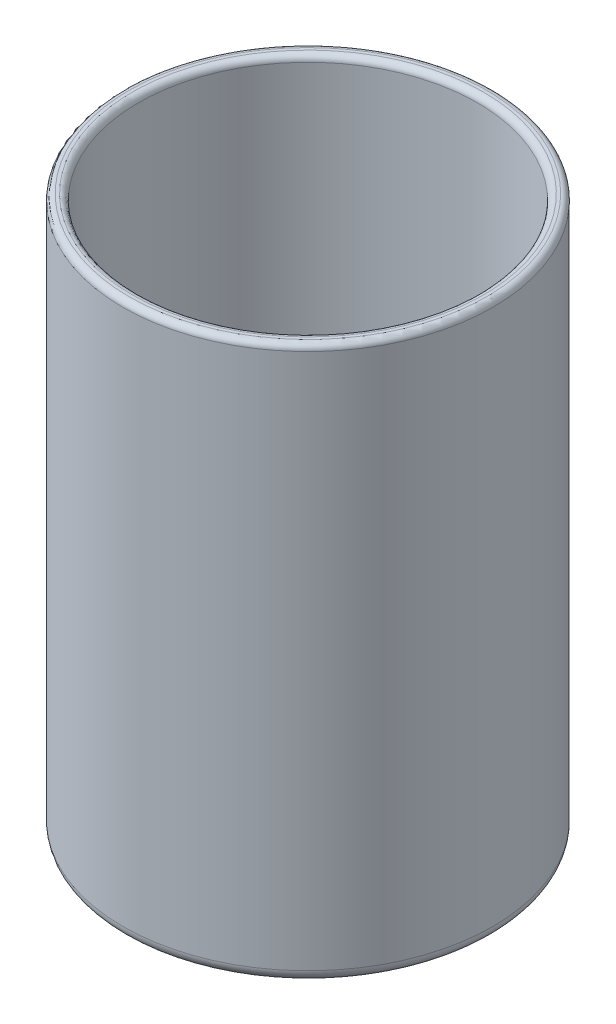
ISO-10303-21;
HEADER;
FILE_DESCRIPTION(('STEP AP214'),'2;1');
FILE_NAME('part.step','',(''),(''),'','','');
FILE_SCHEMA(('AUTOMOTIVE_DESIGN { 1 0 10303 214 1 1 1 1 }'));
ENDSEC;
DATA;
#1=APPLICATION_CONTEXT('core data for automotive mechanical design processes');
#2=APPLICATION_PROTOCOL_DEFINITION('international standard','automotive_design',2000,#1);
#3=PRODUCT_CONTEXT('',#1,'mechanical');
#4=PRODUCT('Part','Part','',(#3));
#5=PRODUCT_RELATED_PRODUCT_CATEGORY('part','',(#4));
#6=PRODUCT_DEFINITION_FORMATION('','',#4);
#7=PRODUCT_DEFINITION_CONTEXT('part definition',#1,'design');
#8=PRODUCT_DEFINITION('design','',#6,#7);
#9=PRODUCT_DEFINITION_SHAPE('','',#8);
#10=(LENGTH_UNIT() NAMED_UNIT(*) SI_UNIT(.MILLI.,.METRE.));
#11=(NAMED_UNIT(*) PLANE_ANGLE_UNIT() SI_UNIT($,.RADIAN.));
#12=(NAMED_UNIT(*) SI_UNIT($,.STERADIAN.) SOLID_ANGLE_UNIT());
#13=UNCERTAINTY_MEASURE_WITH_UNIT(LENGTH_MEASURE(1.E-05),#10,'distance_accuracy_value','');
#14=(GEOMETRIC_REPRESENTATION_CONTEXT(3) GLOBAL_UNCERTAINTY_ASSIGNED_CONTEXT((#13)) GLOBAL_UNIT_ASSIGNED_CONTEXT((#10,
#11,#12)) REPRESENTATION_CONTEXT('',''));
#15=CARTESIAN_POINT('',(0.,0.,0.));
#16=DIRECTION('',(0.,0.,1.));
#17=DIRECTION('',(1.,0.,0.));
#18=AXIS2_PLACEMENT_3D('',#15,#16,#17);
#19=CARTESIAN_POINT('',(0.,5.08,0.));
#20=DIRECTION('',(0.,-1.,0.));
#21=DIRECTION('',(0.,0.,-1.));
#22=AXIS2_PLACEMENT_3D('',#19,#20,#21);
#23=CYLINDRICAL_SURFACE('',#22,38.1);
#24=CARTESIAN_POINT('',(0.,2.54,0.));
#25=DIRECTION('',(0.,1.,0.));
#26=DIRECTION('',(0.,0.,1.));
#27=AXIS2_PLACEMENT_3D('',#24,#25,#26);
#28=CIRCLE('',#27,38.1);
#29=CARTESIAN_POINT('',(0.,2.54,38.1));
#30=VERTEX_POINT('',#29);
#31=EDGE_CURVE('E51',#30,#30,#28,.T.);
#32=ORIENTED_EDGE('',*,*,#31,.T.);
#33=EDGE_LOOP('',(#32));
#34=FACE_BOUND('',#33,.T.);
#35=CARTESIAN_POINT('',(0.,113.03,0.));
#36=DIRECTION('',(0.,1.,0.));
#37=DIRECTION('',(0.,0.,1.));
#38=AXIS2_PLACEMENT_3D('',#35,#36,#37);
#39=CIRCLE('',#38,38.1);
#40=CARTESIAN_POINT('',(0.,113.03,38.1));
#41=VERTEX_POINT('',#40);
#42=EDGE_CURVE('E56',#41,#41,#39,.F.);
#43=ORIENTED_EDGE('',*,*,#42,.T.);
#44=EDGE_LOOP('',(#43));
#45=FACE_BOUND('',#44,.T.);
#46=ADVANCED_FACE('F43',(#34,#45),#23,.T.);
#47=CARTESIAN_POINT('',(0.,0.,0.));
#48=DIRECTION('',(0.,1.,0.));
#49=DIRECTION('',(0.,0.,1.));
#50=AXIS2_PLACEMENT_3D('',#47,#48,#49);
#51=PLANE('',#50);
#52=CARTESIAN_POINT('',(0.,0.,0.));
#53=DIRECTION('',(0.,1.,0.));
#54=DIRECTION('',(0.,0.,1.));
#55=AXIS2_PLACEMENT_3D('',#52,#53,#54);
#56=CIRCLE('',#55,35.56);
#57=CARTESIAN_POINT('',(0.,0.,35.56));
#58=VERTEX_POINT('',#57);
#59=EDGE_CURVE('E10',#58,#58,#56,.F.);
#60=ORIENTED_EDGE('',*,*,#59,.T.);
#61=EDGE_LOOP('',(#60));
#62=FACE_BOUND('',#61,.T.);
#63=ADVANCED_FACE('F100',(#62),#51,.F.);
#64=CARTESIAN_POINT('',(0.,114.3,0.));
#65=DIRECTION('',(0.,1.,0.));
#66=DIRECTION('',(0.,0.,1.));
#67=AXIS2_PLACEMENT_3D('',#64,#65,#66);
#68=PLANE('',#67);
#69=CARTESIAN_POINT('',(0.,114.3,0.));
#70=DIRECTION('',(0.,1.,0.));
#71=DIRECTION('',(0.,0.,1.));
#72=AXIS2_PLACEMENT_3D('',#69,#70,#71);
#73=CIRCLE('',#72,36.195);
#74=CARTESIAN_POINT('',(0.,114.3,36.195));
#75=VERTEX_POINT('',#74);
#76=EDGE_CURVE('E61',#75,#75,#73,.F.);
#77=ORIENTED_EDGE('',*,*,#76,.T.);
#78=EDGE_LOOP('',(#77));
#79=FACE_BOUND('',#78,.T.);
#80=CARTESIAN_POINT('',(0.,114.3,0.));
#81=DIRECTION('',(0.,1.,0.));
#82=DIRECTION('',(0.,0.,1.));
#83=AXIS2_PLACEMENT_3D('',#80,#81,#82);
#84=CIRCLE('',#83,36.83);
#85=CARTESIAN_POINT('',(0.,114.3,36.83));
#86=VERTEX_POINT('',#85);
#87=EDGE_CURVE('E67',#86,#86,#84,.T.);
#88=ORIENTED_EDGE('',*,*,#87,.T.);
#89=EDGE_LOOP('',(#88));
#90=FACE_BOUND('',#89,.T.);
#91=ADVANCED_FACE('F94',(#79,#90),#68,.T.);
#92=CARTESIAN_POINT('',(0.,114.3,0.));
#93=DIRECTION('',(0.,-1.,0.));
#94=DIRECTION('',(0.,0.,-1.));
#95=AXIS2_PLACEMENT_3D('',#92,#93,#94);
#96=CYLINDRICAL_SURFACE('',#95,34.925);
#97=CARTESIAN_POINT('',(0.,113.03,0.));
#98=DIRECTION('',(0.,1.,0.));
#99=DIRECTION('',(0.,0.,1.));
#100=AXIS2_PLACEMENT_3D('',#97,#98,#99);
#101=CIRCLE('',#100,34.925);
#102=CARTESIAN_POINT('',(0.,113.03,34.925));
#103=VERTEX_POINT('',#102);
#104=EDGE_CURVE('E71',#103,#103,#101,.T.);
#105=ORIENTED_EDGE('',*,*,#104,.T.);
#106=EDGE_LOOP('',(#105));
#107=FACE_BOUND('',#106,.T.);
#108=CARTESIAN_POINT('',(0.,5.08,0.));
#109=DIRECTION('',(0.,1.,0.));
#110=DIRECTION('',(0.,0.,1.));
#111=AXIS2_PLACEMENT_3D('',#108,#109,#110);
#112=CIRCLE('',#111,34.925);
#113=CARTESIAN_POINT('',(0.,5.08,34.925));
#114=VERTEX_POINT('',#113);
#115=EDGE_CURVE('E75',#114,#114,#112,.F.);
#116=ORIENTED_EDGE('',*,*,#115,.T.);
#117=EDGE_LOOP('',(#116));
#118=FACE_BOUND('',#117,.T.);
#119=ADVANCED_FACE('F80',(#107,#118),#96,.F.);
#120=CARTESIAN_POINT('',(0.,5.08,0.));
#121=DIRECTION('',(0.,1.,0.));
#122=DIRECTION('',(0.,0.,1.));
#123=AXIS2_PLACEMENT_3D('',#120,#121,#122);
#124=PLANE('',#123);
#125=ORIENTED_EDGE('',*,*,#115,.F.);
#126=EDGE_LOOP('',(#125));
#127=FACE_BOUND('',#126,.T.);
#128=ADVANCED_FACE('F82',(#127),#124,.T.);
#129=CARTESIAN_POINT('',(0.,113.03,0.));
#130=DIRECTION('',(0.,1.,0.));
#131=DIRECTION('',(0.,0.,1.));
#132=AXIS2_PLACEMENT_3D('',#129,#130,#131);
#133=TOROIDAL_SURFACE('',#132,36.195,1.27);
#134=ORIENTED_EDGE('',*,*,#76,.F.);
#135=EDGE_LOOP('',(#134));
#136=FACE_BOUND('',#135,.T.);
#137=ORIENTED_EDGE('',*,*,#104,.F.);
#138=EDGE_LOOP('',(#137));
#139=FACE_BOUND('',#138,.T.);
#140=ADVANCED_FACE('F84',(#136,#139),#133,.T.);
#141=CARTESIAN_POINT('',(0.,113.03,0.));
#142=DIRECTION('',(0.,1.,0.));
#143=DIRECTION('',(0.,0.,1.));
#144=AXIS2_PLACEMENT_3D('',#141,#142,#143);
#145=TOROIDAL_SURFACE('',#144,36.83,1.27);
#146=ORIENTED_EDGE('',*,*,#42,.F.);
#147=EDGE_LOOP('',(#146));
#148=FACE_BOUND('',#147,.T.);
#149=ORIENTED_EDGE('',*,*,#87,.F.);
#150=EDGE_LOOP('',(#149));
#151=FACE_BOUND('',#150,.T.);
#152=ADVANCED_FACE('F90',(#148,#151),#145,.T.);
#153=CARTESIAN_POINT('',(0.,2.54,0.));
#154=DIRECTION('',(0.,1.,0.));
#155=DIRECTION('',(0.,0.,1.));
#156=AXIS2_PLACEMENT_3D('',#153,#154,#155);
#157=TOROIDAL_SURFACE('',#156,35.56,2.54);
#158=ORIENTED_EDGE('',*,*,#59,.F.);
#159=EDGE_LOOP('',(#158));
#160=FACE_BOUND('',#159,.T.);
#161=ORIENTED_EDGE('',*,*,#31,.F.);
#162=EDGE_LOOP('',(#161));
#163=FACE_BOUND('',#162,.T.);
#164=ADVANCED_FACE('F45',(#160,#163),#157,.T.);
#165=CLOSED_SHELL('',(#46,#63,#91,#119,#128,#140,#152,#164));
#166=MANIFOLD_SOLID_BREP('B2',#165);
#167=ADVANCED_BREP_SHAPE_REPRESENTATION('',(#18,#166),#14);
#168=SHAPE_DEFINITION_REPRESENTATION(#9,#167);
ENDSEC;
END-ISO-10303-21;
